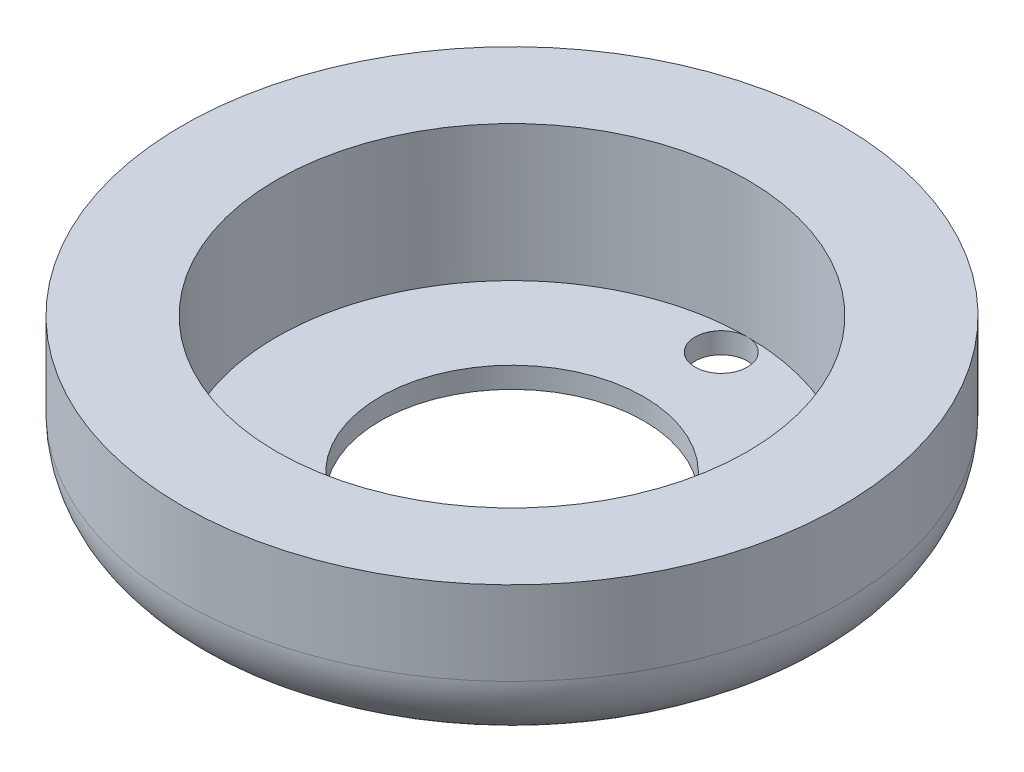
ISO-10303-21;
HEADER;
FILE_DESCRIPTION(('STEP AP214'),'2;1');
FILE_NAME('part.step','',(''),(''),'','','');
FILE_SCHEMA(('AUTOMOTIVE_DESIGN { 1 0 10303 214 1 1 1 1 }'));
ENDSEC;
DATA;
#1=APPLICATION_CONTEXT('core data for automotive mechanical design processes');
#2=APPLICATION_PROTOCOL_DEFINITION('international standard','automotive_design',2000,#1);
#3=PRODUCT_CONTEXT('',#1,'mechanical');
#4=PRODUCT('Part','Part','',(#3));
#5=PRODUCT_RELATED_PRODUCT_CATEGORY('part','',(#4));
#6=PRODUCT_DEFINITION_FORMATION('','',#4);
#7=PRODUCT_DEFINITION_CONTEXT('part definition',#1,'design');
#8=PRODUCT_DEFINITION('design','',#6,#7);
#9=PRODUCT_DEFINITION_SHAPE('','',#8);
#10=(LENGTH_UNIT() NAMED_UNIT(*) SI_UNIT(.MILLI.,.METRE.));
#11=(NAMED_UNIT(*) PLANE_ANGLE_UNIT() SI_UNIT($,.RADIAN.));
#12=(NAMED_UNIT(*) SI_UNIT($,.STERADIAN.) SOLID_ANGLE_UNIT());
#13=UNCERTAINTY_MEASURE_WITH_UNIT(LENGTH_MEASURE(1.E-05),#10,'distance_accuracy_value','');
#14=(GEOMETRIC_REPRESENTATION_CONTEXT(3) GLOBAL_UNCERTAINTY_ASSIGNED_CONTEXT((#13)) GLOBAL_UNIT_ASSIGNED_CONTEXT((#10,
#11,#12)) REPRESENTATION_CONTEXT('',''));
#15=CARTESIAN_POINT('',(0.,0.,0.));
#16=DIRECTION('',(0.,0.,1.));
#17=DIRECTION('',(1.,0.,0.));
#18=AXIS2_PLACEMENT_3D('',#15,#16,#17);
#19=CARTESIAN_POINT('',(0.,15.,0.));
#20=DIRECTION('',(0.,-1.,0.));
#21=DIRECTION('',(0.,0.,-1.));
#22=AXIS2_PLACEMENT_3D('',#19,#20,#21);
#23=CYLINDRICAL_SURFACE('',#22,31.5);
#24=CARTESIAN_POINT('',(0.,7.,0.));
#25=DIRECTION('',(0.,1.,0.));
#26=DIRECTION('',(0.,0.,1.));
#27=AXIS2_PLACEMENT_3D('',#24,#25,#26);
#28=CIRCLE('',#27,31.5);
#29=CARTESIAN_POINT('',(0.,7.,31.5));
#30=VERTEX_POINT('',#29);
#31=EDGE_CURVE('E44',#30,#30,#28,.T.);
#32=ORIENTED_EDGE('',*,*,#31,.T.);
#33=EDGE_LOOP('',(#32));
#34=FACE_BOUND('',#33,.T.);
#35=CARTESIAN_POINT('',(0.,15.,0.));
#36=DIRECTION('',(0.,1.,0.));
#37=DIRECTION('',(0.,0.,1.));
#38=AXIS2_PLACEMENT_3D('',#35,#36,#37);
#39=CIRCLE('',#38,31.5);
#40=CARTESIAN_POINT('',(0.,15.,31.5));
#41=VERTEX_POINT('',#40);
#42=EDGE_CURVE('E68',#41,#41,#39,.T.);
#43=ORIENTED_EDGE('',*,*,#42,.F.);
#44=EDGE_LOOP('',(#43));
#45=FACE_BOUND('',#44,.T.);
#46=ADVANCED_FACE('F36',(#34,#45),#23,.T.);
#47=CARTESIAN_POINT('',(0.,15.,0.));
#48=DIRECTION('',(0.,1.,0.));
#49=DIRECTION('',(0.,0.,1.));
#50=AXIS2_PLACEMENT_3D('',#47,#48,#49);
#51=PLANE('',#50);
#52=CARTESIAN_POINT('',(0.,15.,0.));
#53=DIRECTION('',(0.,1.,0.));
#54=DIRECTION('',(0.,0.,1.));
#55=AXIS2_PLACEMENT_3D('',#52,#53,#54);
#56=CIRCLE('',#55,22.5);
#57=CARTESIAN_POINT('',(0.,15.,22.5));
#58=VERTEX_POINT('',#57);
#59=EDGE_CURVE('E71',#58,#58,#56,.T.);
#60=ORIENTED_EDGE('',*,*,#59,.F.);
#61=EDGE_LOOP('',(#60));
#62=FACE_BOUND('',#61,.T.);
#63=ORIENTED_EDGE('',*,*,#42,.T.);
#64=EDGE_LOOP('',(#63));
#65=FACE_BOUND('',#64,.T.);
#66=ADVANCED_FACE('F90',(#62,#65),#51,.T.);
#67=CARTESIAN_POINT('',(0.,0.,0.));
#68=DIRECTION('',(0.,1.,0.));
#69=DIRECTION('',(0.,0.,1.));
#70=AXIS2_PLACEMENT_3D('',#67,#68,#69);
#71=PLANE('',#70);
#72=CARTESIAN_POINT('',(0.,0.,0.));
#73=DIRECTION('',(0.,1.,0.));
#74=DIRECTION('',(0.,0.,1.));
#75=AXIS2_PLACEMENT_3D('',#72,#73,#74);
#76=CIRCLE('',#75,24.5);
#77=CARTESIAN_POINT('',(0.,0.,24.5));
#78=VERTEX_POINT('',#77);
#79=EDGE_CURVE('E11',#78,#78,#76,.F.);
#80=ORIENTED_EDGE('',*,*,#79,.T.);
#81=EDGE_LOOP('',(#80));
#82=FACE_BOUND('',#81,.T.);
#83=CARTESIAN_POINT('',(0.,0.,-20.));
#84=DIRECTION('',(0.,-1.,0.));
#85=DIRECTION('',(0.,0.,-1.));
#86=AXIS2_PLACEMENT_3D('',#83,#84,#85);
#87=CIRCLE('',#86,2.5);
#88=CARTESIAN_POINT('',(0.,0.,-22.5));
#89=VERTEX_POINT('',#88);
#90=EDGE_CURVE('E60',#89,#89,#87,.T.);
#91=ORIENTED_EDGE('',*,*,#90,.F.);
#92=EDGE_LOOP('',(#91));
#93=FACE_BOUND('',#92,.T.);
#94=CARTESIAN_POINT('',(0.,0.,0.));
#95=DIRECTION('',(0.,-1.,0.));
#96=DIRECTION('',(0.,0.,-1.));
#97=AXIS2_PLACEMENT_3D('',#94,#95,#96);
#98=CIRCLE('',#97,12.6);
#99=CARTESIAN_POINT('',(0.,0.,-12.6));
#100=VERTEX_POINT('',#99);
#101=EDGE_CURVE('E65',#100,#100,#98,.T.);
#102=ORIENTED_EDGE('',*,*,#101,.F.);
#103=EDGE_LOOP('',(#102));
#104=FACE_BOUND('',#103,.T.);
#105=CARTESIAN_POINT('',(0.,0.,20.));
#106=DIRECTION('',(0.,-1.,0.));
#107=DIRECTION('',(0.,0.,-1.));
#108=AXIS2_PLACEMENT_3D('',#105,#106,#107);
#109=CIRCLE('',#108,2.5);
#110=CARTESIAN_POINT('',(0.,0.,17.5));
#111=VERTEX_POINT('',#110);
#112=EDGE_CURVE('E83',#111,#111,#109,.T.);
#113=ORIENTED_EDGE('',*,*,#112,.F.);
#114=EDGE_LOOP('',(#113));
#115=FACE_BOUND('',#114,.T.);
#116=ADVANCED_FACE('F92',(#82,#93,#104,#115),#71,.F.);
#117=CARTESIAN_POINT('',(0.,2.,0.));
#118=DIRECTION('',(0.,1.,0.));
#119=DIRECTION('',(0.,0.,1.));
#120=AXIS2_PLACEMENT_3D('',#117,#118,#119);
#121=CYLINDRICAL_SURFACE('',#120,22.5);
#122=CARTESIAN_POINT('',(0.,2.,0.));
#123=DIRECTION('',(0.,1.,0.));
#124=DIRECTION('',(0.,0.,1.));
#125=AXIS2_PLACEMENT_3D('',#122,#123,#124);
#126=CIRCLE('',#125,22.5);
#127=CARTESIAN_POINT('',(0.,2.,-22.5));
#128=VERTEX_POINT('',#127);
#129=CARTESIAN_POINT('',(0.,2.,22.5));
#130=VERTEX_POINT('',#129);
#131=EDGE_CURVE('E79',#128,#130,#126,.T.);
#132=ORIENTED_EDGE('',*,*,#131,.F.);
#133=EDGE_CURVE('E76',#130,#128,#126,.T.);
#134=ORIENTED_EDGE('',*,*,#133,.F.);
#135=EDGE_LOOP('',(#132,#134));
#136=FACE_BOUND('',#135,.T.);
#137=ORIENTED_EDGE('',*,*,#59,.T.);
#138=EDGE_LOOP('',(#137));
#139=FACE_BOUND('',#138,.T.);
#140=ADVANCED_FACE('F88',(#136,#139),#121,.F.);
#141=CARTESIAN_POINT('',(0.,2.,0.));
#142=DIRECTION('',(0.,1.,0.));
#143=DIRECTION('',(0.,0.,1.));
#144=AXIS2_PLACEMENT_3D('',#141,#142,#143);
#145=PLANE('',#144);
#146=CARTESIAN_POINT('',(0.,2.,0.));
#147=DIRECTION('',(0.,1.,0.));
#148=DIRECTION('',(0.,0.,1.));
#149=AXIS2_PLACEMENT_3D('',#146,#147,#148);
#150=CIRCLE('',#149,12.6);
#151=CARTESIAN_POINT('',(0.,2.,-12.6));
#152=VERTEX_POINT('',#151);
#153=EDGE_CURVE('E59',#152,#152,#150,.T.);
#154=ORIENTED_EDGE('',*,*,#153,.F.);
#155=EDGE_LOOP('',(#154));
#156=FACE_BOUND('',#155,.T.);
#157=ORIENTED_EDGE('',*,*,#133,.T.);
#158=CARTESIAN_POINT('',(0.,2.,-20.));
#159=DIRECTION('',(0.,1.,0.));
#160=DIRECTION('',(0.,0.,1.));
#161=AXIS2_PLACEMENT_3D('',#158,#159,#160);
#162=CIRCLE('',#161,2.5);
#163=EDGE_CURVE('E49',#128,#128,#162,.T.);
#164=ORIENTED_EDGE('',*,*,#163,.F.);
#165=ORIENTED_EDGE('',*,*,#131,.T.);
#166=CARTESIAN_POINT('',(0.,2.,20.));
#167=DIRECTION('',(0.,1.,0.));
#168=DIRECTION('',(0.,0.,1.));
#169=AXIS2_PLACEMENT_3D('',#166,#167,#168);
#170=CIRCLE('',#169,2.5);
#171=EDGE_CURVE('E53',#130,#130,#170,.T.);
#172=ORIENTED_EDGE('',*,*,#171,.F.);
#173=EDGE_LOOP('',(#157,#164,#165,#172));
#174=FACE_BOUND('',#173,.T.);
#175=ADVANCED_FACE('F103',(#156,#174),#145,.T.);
#176=CARTESIAN_POINT('',(0.,13.,20.));
#177=DIRECTION('',(0.,-1.,0.));
#178=DIRECTION('',(0.,0.,-1.));
#179=AXIS2_PLACEMENT_3D('',#176,#177,#178);
#180=CYLINDRICAL_SURFACE('',#179,2.5);
#181=ORIENTED_EDGE('',*,*,#171,.T.);
#182=EDGE_LOOP('',(#181));
#183=FACE_BOUND('',#182,.T.);
#184=ORIENTED_EDGE('',*,*,#112,.T.);
#185=EDGE_LOOP('',(#184));
#186=FACE_BOUND('',#185,.T.);
#187=ADVANCED_FACE('F54',(#183,#186),#180,.F.);
#188=CARTESIAN_POINT('',(0.,13.,0.));
#189=DIRECTION('',(0.,-1.,0.));
#190=DIRECTION('',(0.,0.,-1.));
#191=AXIS2_PLACEMENT_3D('',#188,#189,#190);
#192=CYLINDRICAL_SURFACE('',#191,12.6);
#193=CARTESIAN_POINT('',(0.,2.,-12.6));
#194=CARTESIAN_POINT('',(0.,1.97916666666667,-12.6));
#195=CARTESIAN_POINT('',(0.,1.95833333333333,-12.6));
#196=CARTESIAN_POINT('',(0.,1.91666666666666,-12.6));
#197=CARTESIAN_POINT('',(0.,1.89583333333333,-12.6));
#198=CARTESIAN_POINT('',(0.,1.85416666666666,-12.6));
#199=CARTESIAN_POINT('',(0.,1.83333333333333,-12.6));
#200=CARTESIAN_POINT('',(0.,1.79166666666666,-12.6));
#201=CARTESIAN_POINT('',(0.,1.77083333333333,-12.6));
#202=CARTESIAN_POINT('',(0.,1.72916666666666,-12.6));
#203=CARTESIAN_POINT('',(0.,1.70833333333333,-12.6));
#204=CARTESIAN_POINT('',(0.,1.66666666666666,-12.6));
#205=CARTESIAN_POINT('',(0.,1.64583333333333,-12.6));
#206=CARTESIAN_POINT('',(0.,1.60416666666666,-12.6));
#207=CARTESIAN_POINT('',(0.,1.58333333333333,-12.6));
#208=CARTESIAN_POINT('',(0.,1.54166666666666,-12.6));
#209=CARTESIAN_POINT('',(0.,1.52083333333333,-12.6));
#210=CARTESIAN_POINT('',(0.,1.47916666666667,-12.6));
#211=CARTESIAN_POINT('',(0.,1.45833333333333,-12.6));
#212=CARTESIAN_POINT('',(0.,1.41666666666667,-12.6));
#213=CARTESIAN_POINT('',(0.,1.39583333333333,-12.6));
#214=CARTESIAN_POINT('',(0.,1.35416666666667,-12.6));
#215=CARTESIAN_POINT('',(0.,1.33333333333333,-12.6));
#216=CARTESIAN_POINT('',(0.,1.29166666666667,-12.6));
#217=CARTESIAN_POINT('',(0.,1.27083333333333,-12.6));
#218=CARTESIAN_POINT('',(0.,1.22916666666667,-12.6));
#219=CARTESIAN_POINT('',(0.,1.20833333333333,-12.6));
#220=CARTESIAN_POINT('',(0.,1.16666666666667,-12.6));
#221=CARTESIAN_POINT('',(0.,1.14583333333333,-12.6));
#222=CARTESIAN_POINT('',(0.,1.10416666666667,-12.6));
#223=CARTESIAN_POINT('',(0.,1.08333333333333,-12.6));
#224=CARTESIAN_POINT('',(0.,1.04166666666667,-12.6));
#225=CARTESIAN_POINT('',(0.,1.02083333333333,-12.6));
#226=CARTESIAN_POINT('',(0.,0.979166666666666,-12.6));
#227=CARTESIAN_POINT('',(0.,0.958333333333332,-12.6));
#228=CARTESIAN_POINT('',(0.,0.916666666666666,-12.6));
#229=CARTESIAN_POINT('',(0.,0.895833333333332,-12.6));
#230=CARTESIAN_POINT('',(0.,0.854166666666666,-12.6));
#231=CARTESIAN_POINT('',(0.,0.833333333333332,-12.6));
#232=CARTESIAN_POINT('',(0.,0.791666666666666,-12.6));
#233=CARTESIAN_POINT('',(0.,0.770833333333332,-12.6));
#234=CARTESIAN_POINT('',(0.,0.729166666666666,-12.6));
#235=CARTESIAN_POINT('',(0.,0.708333333333332,-12.6));
#236=CARTESIAN_POINT('',(0.,0.666666666666666,-12.6));
#237=CARTESIAN_POINT('',(0.,0.645833333333332,-12.6));
#238=CARTESIAN_POINT('',(0.,0.604166666666666,-12.6));
#239=CARTESIAN_POINT('',(0.,0.583333333333333,-12.6));
#240=CARTESIAN_POINT('',(0.,0.541666666666667,-12.6));
#241=CARTESIAN_POINT('',(0.,0.520833333333334,-12.6));
#242=CARTESIAN_POINT('',(0.,0.479166666666667,-12.6));
#243=CARTESIAN_POINT('',(0.,0.458333333333334,-12.6));
#244=CARTESIAN_POINT('',(0.,0.416666666666667,-12.6));
#245=CARTESIAN_POINT('',(0.,0.395833333333334,-12.6));
#246=CARTESIAN_POINT('',(0.,0.354166666666667,-12.6));
#247=CARTESIAN_POINT('',(0.,0.333333333333334,-12.6));
#248=CARTESIAN_POINT('',(0.,0.291666666666667,-12.6));
#249=CARTESIAN_POINT('',(0.,0.270833333333334,-12.6));
#250=CARTESIAN_POINT('',(0.,0.229166666666667,-12.6));
#251=CARTESIAN_POINT('',(0.,0.208333333333334,-12.6));
#252=CARTESIAN_POINT('',(0.,0.166666666666667,-12.6));
#253=CARTESIAN_POINT('',(0.,0.145833333333333,-12.6));
#254=CARTESIAN_POINT('',(0.,0.104166666666667,-12.6));
#255=CARTESIAN_POINT('',(0.,0.0833333333333334,-12.6));
#256=CARTESIAN_POINT('',(0.,0.0416666666666667,-12.6));
#257=CARTESIAN_POINT('',(0.,0.0208333333333333,-12.6));
#258=CARTESIAN_POINT('',(0.,0.,-12.6));
#259=B_SPLINE_CURVE_WITH_KNOTS('',3,(#193,#194,#195,#196,#197,#198,#199,#200,#201,#202,#203,
#204,#205,#206,#207,#208,#209,#210,#211,#212,#213,#214,#215,#216,#217,#218,#219,#220,#221,#222,
#223,#224,#225,#226,#227,#228,#229,#230,#231,#232,#233,#234,#235,#236,#237,#238,#239,#240,#241,
#242,#243,#244,#245,#246,#247,#248,#249,#250,#251,#252,#253,#254,#255,#256,#257,#258),
.UNSPECIFIED.,.F.,.F.,(4,2,2,2,2,2,2,2,2,2,2,2,2,2,2,2,2,2,2,2,2,2,2,2,2,2,2,2,2,2,2,2,4),(0.,
0.0625000000000001,0.125,0.1875,0.25,0.3125,0.375,0.4375,0.5,0.562499999999999,
0.624999999999999,0.687499999999999,0.749999999999999,0.812499999999999,0.874999999999999,
0.937499999999999,0.999999999999999,1.0625,1.125,1.1875,1.25,1.3125,1.375,1.4375,1.5,1.5625,
1.625,1.6875,1.75,1.8125,1.875,1.9375,2.),.UNSPECIFIED.);
#260=EDGE_CURVE('BSEAM110',#152,#100,#259,.T.);
#261=ORIENTED_EDGE('',*,*,#153,.T.);
#262=ORIENTED_EDGE('',*,*,#101,.T.);
#263=ORIENTED_EDGE('',*,*,#260,.T.);
#264=ORIENTED_EDGE('',*,*,#260,.F.);
#265=EDGE_LOOP('',(#261,#263,#262,#264));
#266=FACE_BOUND('',#265,.T.);
#267=ADVANCED_FACE('F110',(#266),#192,.F.);
#268=CARTESIAN_POINT('',(0.,13.,-20.));
#269=DIRECTION('',(0.,-1.,0.));
#270=DIRECTION('',(0.,0.,-1.));
#271=AXIS2_PLACEMENT_3D('',#268,#269,#270);
#272=CYLINDRICAL_SURFACE('',#271,2.5);
#273=ORIENTED_EDGE('',*,*,#163,.T.);
#274=EDGE_LOOP('',(#273));
#275=FACE_BOUND('',#274,.T.);
#276=ORIENTED_EDGE('',*,*,#90,.T.);
#277=EDGE_LOOP('',(#276));
#278=FACE_BOUND('',#277,.T.);
#279=ADVANCED_FACE('F113',(#275,#278),#272,.F.);
#280=CARTESIAN_POINT('',(0.,7.,0.));
#281=DIRECTION('',(0.,1.,0.));
#282=DIRECTION('',(0.,0.,1.));
#283=AXIS2_PLACEMENT_3D('',#280,#281,#282);
#284=TOROIDAL_SURFACE('',#283,24.5,7.);
#285=ORIENTED_EDGE('',*,*,#79,.F.);
#286=EDGE_LOOP('',(#285));
#287=FACE_BOUND('',#286,.T.);
#288=ORIENTED_EDGE('',*,*,#31,.F.);
#289=EDGE_LOOP('',(#288));
#290=FACE_BOUND('',#289,.T.);
#291=ADVANCED_FACE('F38',(#287,#290),#284,.T.);
#292=CLOSED_SHELL('',(#46,#66,#116,#140,#175,#187,#267,#279,#291));
#293=MANIFOLD_SOLID_BREP('B2',#292);
#294=ADVANCED_BREP_SHAPE_REPRESENTATION('',(#18,#293),#14);
#295=SHAPE_DEFINITION_REPRESENTATION(#9,#294);
ENDSEC;
END-ISO-10303-21;
